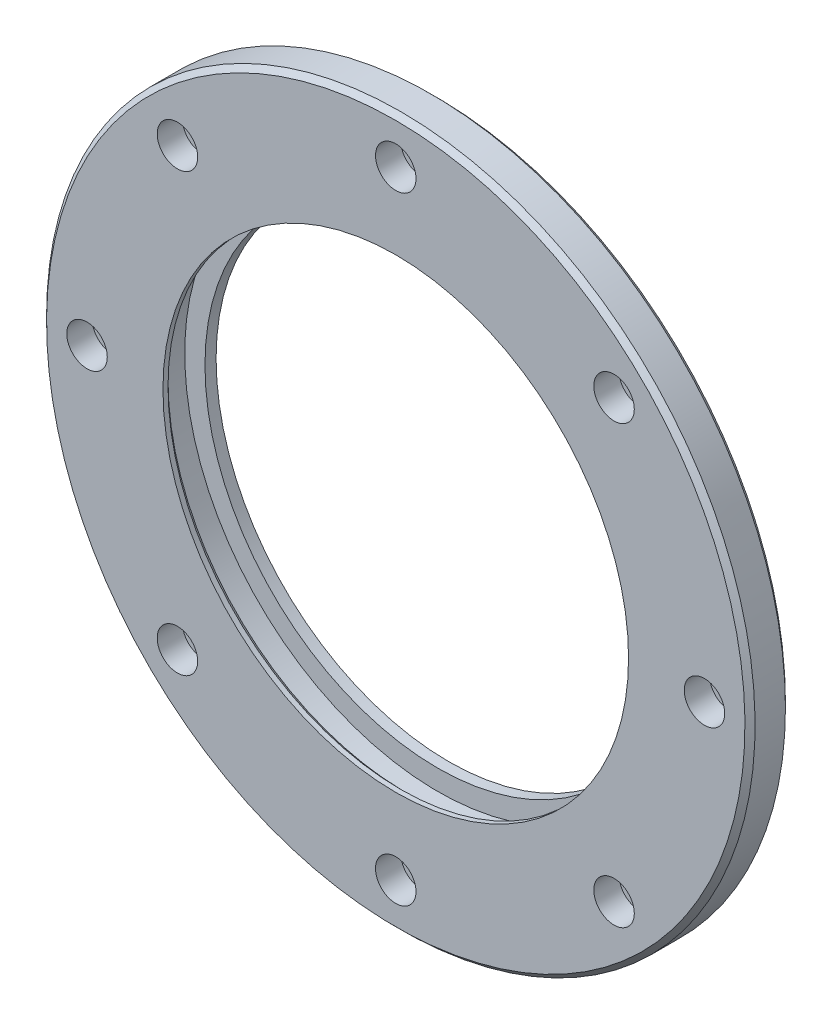
ISO-10303-21;
HEADER;
FILE_DESCRIPTION(('STEP AP214'),'2;1');
FILE_NAME('part.step','',(''),(''),'','','');
FILE_SCHEMA(('AUTOMOTIVE_DESIGN { 1 0 10303 214 1 1 1 1 }'));
ENDSEC;
DATA;
#1=APPLICATION_CONTEXT('core data for automotive mechanical design processes');
#2=APPLICATION_PROTOCOL_DEFINITION('international standard','automotive_design',2000,#1);
#3=PRODUCT_CONTEXT('',#1,'mechanical');
#4=PRODUCT('Part','Part','',(#3));
#5=PRODUCT_RELATED_PRODUCT_CATEGORY('part','',(#4));
#6=PRODUCT_DEFINITION_FORMATION('','',#4);
#7=PRODUCT_DEFINITION_CONTEXT('part definition',#1,'design');
#8=PRODUCT_DEFINITION('design','',#6,#7);
#9=PRODUCT_DEFINITION_SHAPE('','',#8);
#10=(LENGTH_UNIT() NAMED_UNIT(*) SI_UNIT(.MILLI.,.METRE.));
#11=(NAMED_UNIT(*) PLANE_ANGLE_UNIT() SI_UNIT($,.RADIAN.));
#12=(NAMED_UNIT(*) SI_UNIT($,.STERADIAN.) SOLID_ANGLE_UNIT());
#13=UNCERTAINTY_MEASURE_WITH_UNIT(LENGTH_MEASURE(1.E-05),#10,'distance_accuracy_value','');
#14=(GEOMETRIC_REPRESENTATION_CONTEXT(3) GLOBAL_UNCERTAINTY_ASSIGNED_CONTEXT((#13)) GLOBAL_UNIT_ASSIGNED_CONTEXT((#10,
#11,#12)) REPRESENTATION_CONTEXT('',''));
#15=CARTESIAN_POINT('',(0.,0.,0.));
#16=DIRECTION('',(0.,0.,1.));
#17=DIRECTION('',(1.,0.,0.));
#18=AXIS2_PLACEMENT_3D('',#15,#16,#17);
#19=CARTESIAN_POINT('',(0.,-15.,-42.5383077103199));
#20=DIRECTION('',(0.,0.,-1.));
#21=DIRECTION('',(-1.,0.,0.));
#22=AXIS2_PLACEMENT_3D('',#19,#20,#21);
#23=CONICAL_SURFACE('',#22,53.,0.785398163397448);
#24=CARTESIAN_POINT('',(0.,-15.,-42.5383077103199));
#25=DIRECTION('',(0.,0.,-1.));
#26=DIRECTION('',(-1.,0.,0.));
#27=AXIS2_PLACEMENT_3D('',#24,#25,#26);
#28=CIRCLE('',#27,53.);
#29=CARTESIAN_POINT('',(-53.,-15.,-42.5383077103199));
#30=VERTEX_POINT('',#29);
#31=EDGE_CURVE('E19',#30,#30,#28,.T.);
#32=ORIENTED_EDGE('',*,*,#31,.T.);
#33=EDGE_LOOP('',(#32));
#34=FACE_BOUND('',#33,.T.);
#35=CARTESIAN_POINT('',(0.,-15.,-42.0383077103199));
#36=DIRECTION('',(0.,0.,-1.));
#37=DIRECTION('',(-1.,0.,0.));
#38=AXIS2_PLACEMENT_3D('',#35,#36,#37);
#39=CIRCLE('',#38,52.5);
#40=CARTESIAN_POINT('',(-52.5,-15.,-42.0383077103199));
#41=VERTEX_POINT('',#40);
#42=EDGE_CURVE('E31',#41,#41,#39,.F.);
#43=ORIENTED_EDGE('',*,*,#42,.T.);
#44=EDGE_LOOP('',(#43));
#45=FACE_BOUND('',#44,.T.);
#46=ADVANCED_FACE('F16',(#34,#45),#23,.F.);
#47=CARTESIAN_POINT('',(0.,-15.,-38.0383077103199));
#48=DIRECTION('',(0.,0.,-1.));
#49=DIRECTION('',(-1.,0.,0.));
#50=AXIS2_PLACEMENT_3D('',#47,#48,#49);
#51=CYLINDRICAL_SURFACE('',#50,52.5);
#52=CARTESIAN_POINT('',(0.,-15.,-40.5383077103199));
#53=DIRECTION('',(0.,0.,-1.));
#54=DIRECTION('',(-1.,0.,0.));
#55=AXIS2_PLACEMENT_3D('',#52,#53,#54);
#56=CIRCLE('',#55,52.5);
#57=CARTESIAN_POINT('',(-52.5,-15.,-40.5383077103199));
#58=VERTEX_POINT('',#57);
#59=EDGE_CURVE('E156',#58,#58,#56,.F.);
#60=ORIENTED_EDGE('',*,*,#59,.T.);
#61=EDGE_LOOP('',(#60));
#62=FACE_BOUND('',#61,.T.);
#63=ORIENTED_EDGE('',*,*,#42,.F.);
#64=EDGE_LOOP('',(#63));
#65=FACE_BOUND('',#64,.T.);
#66=ADVANCED_FACE('F167',(#62,#65),#51,.F.);
#67=CARTESIAN_POINT('',(0.,-15.,-42.5383077103199));
#68=DIRECTION('',(0.,0.,1.));
#69=DIRECTION('',(1.,0.,0.));
#70=AXIS2_PLACEMENT_3D('',#67,#68,#69);
#71=PLANE('',#70);
#72=CARTESIAN_POINT('',(0.,-15.,-42.5383077103199));
#73=DIRECTION('',(0.,0.,1.));
#74=DIRECTION('',(1.,0.,0.));
#75=AXIS2_PLACEMENT_3D('',#72,#73,#74);
#76=CIRCLE('',#75,54.5);
#77=CARTESIAN_POINT('',(54.5,-15.,-42.5383077103199));
#78=VERTEX_POINT('',#77);
#79=EDGE_CURVE('E154',#78,#78,#76,.T.);
#80=ORIENTED_EDGE('',*,*,#79,.F.);
#81=EDGE_LOOP('',(#80));
#82=FACE_BOUND('',#81,.T.);
#83=ORIENTED_EDGE('',*,*,#31,.F.);
#84=EDGE_LOOP('',(#83));
#85=FACE_BOUND('',#84,.T.);
#86=ADVANCED_FACE('F169',(#82,#85),#71,.F.);
#87=CARTESIAN_POINT('',(0.,-15.,-40.5383077103199));
#88=DIRECTION('',(0.,0.,1.));
#89=DIRECTION('',(1.,0.,0.));
#90=AXIS2_PLACEMENT_3D('',#87,#88,#89);
#91=PLANE('',#90);
#92=CARTESIAN_POINT('',(0.,-15.,-40.5383077103199));
#93=DIRECTION('',(0.,0.,1.));
#94=DIRECTION('',(1.,0.,0.));
#95=AXIS2_PLACEMENT_3D('',#92,#93,#94);
#96=CIRCLE('',#95,46.);
#97=CARTESIAN_POINT('',(46.,-15.,-40.5383077103199));
#98=VERTEX_POINT('',#97);
#99=EDGE_CURVE('E151',#98,#98,#96,.T.);
#100=ORIENTED_EDGE('',*,*,#99,.T.);
#101=EDGE_LOOP('',(#100));
#102=FACE_BOUND('',#101,.T.);
#103=ORIENTED_EDGE('',*,*,#59,.F.);
#104=EDGE_LOOP('',(#103));
#105=FACE_BOUND('',#104,.T.);
#106=ADVANCED_FACE('F175',(#102,#105),#91,.F.);
#107=CARTESIAN_POINT('',(0.,-15.,-42.0383077103199));
#108=DIRECTION('',(0.,0.,1.));
#109=DIRECTION('',(1.,0.,0.));
#110=AXIS2_PLACEMENT_3D('',#107,#108,#109);
#111=CONICAL_SURFACE('',#110,55.,0.785398163397428);
#112=ORIENTED_EDGE('',*,*,#79,.T.);
#113=EDGE_LOOP('',(#112));
#114=FACE_BOUND('',#113,.T.);
#115=CARTESIAN_POINT('',(0.,-15.,-42.0383077103199));
#116=DIRECTION('',(0.,0.,-1.));
#117=DIRECTION('',(-1.,0.,0.));
#118=AXIS2_PLACEMENT_3D('',#115,#116,#117);
#119=CIRCLE('',#118,55.);
#120=CARTESIAN_POINT('',(-55.,-15.,-42.0383077103199));
#121=VERTEX_POINT('',#120);
#122=EDGE_CURVE('E150',#121,#121,#119,.F.);
#123=ORIENTED_EDGE('',*,*,#122,.F.);
#124=EDGE_LOOP('',(#123));
#125=FACE_BOUND('',#124,.T.);
#126=ADVANCED_FACE('F324',(#114,#125),#111,.T.);
#127=CARTESIAN_POINT('',(0.,-15.,-191.030731759495));
#128=DIRECTION('',(0.,0.,1.));
#129=DIRECTION('',(1.,0.,0.));
#130=AXIS2_PLACEMENT_3D('',#127,#128,#129);
#131=CYLINDRICAL_SURFACE('',#130,46.);
#132=ORIENTED_EDGE('',*,*,#99,.F.);
#133=EDGE_LOOP('',(#132));
#134=FACE_BOUND('',#133,.T.);
#135=CARTESIAN_POINT('',(0.,-15.,-38.3383077103199));
#136=DIRECTION('',(0.,0.,1.));
#137=DIRECTION('',(1.,0.,0.));
#138=AXIS2_PLACEMENT_3D('',#135,#136,#137);
#139=CIRCLE('',#138,46.);
#140=CARTESIAN_POINT('',(46.,-15.,-38.3383077103199));
#141=VERTEX_POINT('',#140);
#142=EDGE_CURVE('E147',#141,#141,#139,.F.);
#143=ORIENTED_EDGE('',*,*,#142,.F.);
#144=EDGE_LOOP('',(#143));
#145=FACE_BOUND('',#144,.T.);
#146=ADVANCED_FACE('F320',(#134,#145),#131,.F.);
#147=CARTESIAN_POINT('',(0.,-15.,-38.0383077103199));
#148=DIRECTION('',(0.,0.,-1.));
#149=DIRECTION('',(-1.,0.,0.));
#150=AXIS2_PLACEMENT_3D('',#147,#148,#149);
#151=CYLINDRICAL_SURFACE('',#150,55.);
#152=CARTESIAN_POINT('',(0.,-15.,-38.0383077103199));
#153=DIRECTION('',(0.,0.,-1.));
#154=DIRECTION('',(-1.,0.,0.));
#155=AXIS2_PLACEMENT_3D('',#152,#153,#154);
#156=CIRCLE('',#155,55.);
#157=CARTESIAN_POINT('',(-55.,-15.,-38.0383077103199));
#158=VERTEX_POINT('',#157);
#159=EDGE_CURVE('E144',#158,#158,#156,.T.);
#160=ORIENTED_EDGE('',*,*,#159,.T.);
#161=EDGE_LOOP('',(#160));
#162=FACE_BOUND('',#161,.T.);
#163=ORIENTED_EDGE('',*,*,#122,.T.);
#164=EDGE_LOOP('',(#163));
#165=FACE_BOUND('',#164,.T.);
#166=ADVANCED_FACE('F316',(#162,#165),#151,.T.);
#167=CARTESIAN_POINT('',(0.,-15.,-38.3383077103199));
#168=DIRECTION('',(0.,0.,1.));
#169=DIRECTION('',(1.,0.,0.));
#170=AXIS2_PLACEMENT_3D('',#167,#168,#169);
#171=PLANE('',#170);
#172=ORIENTED_EDGE('',*,*,#142,.T.);
#173=EDGE_LOOP('',(#172));
#174=FACE_BOUND('',#173,.T.);
#175=CARTESIAN_POINT('',(0.,-15.,-38.3383077103199));
#176=DIRECTION('',(0.,0.,1.));
#177=DIRECTION('',(1.,0.,0.));
#178=AXIS2_PLACEMENT_3D('',#175,#176,#177);
#179=CIRCLE('',#178,50.);
#180=CARTESIAN_POINT('',(50.,-15.,-38.3383077103199));
#181=VERTEX_POINT('',#180);
#182=EDGE_CURVE('E141',#181,#181,#179,.T.);
#183=ORIENTED_EDGE('',*,*,#182,.T.);
#184=EDGE_LOOP('',(#183));
#185=FACE_BOUND('',#184,.T.);
#186=ADVANCED_FACE('F312',(#174,#185),#171,.T.);
#187=CARTESIAN_POINT('',(0.,-15.,-38.0383077103199));
#188=DIRECTION('',(0.,0.,1.));
#189=DIRECTION('',(1.,0.,0.));
#190=AXIS2_PLACEMENT_3D('',#187,#188,#189);
#191=PLANE('',#190);
#192=ORIENTED_EDGE('',*,*,#159,.F.);
#193=EDGE_LOOP('',(#192));
#194=FACE_BOUND('',#193,.T.);
#195=CARTESIAN_POINT('',(0.,46.,-38.0383077103199));
#196=DIRECTION('',(0.,0.,1.));
#197=DIRECTION('',(1.,0.,0.));
#198=AXIS2_PLACEMENT_3D('',#195,#196,#197);
#199=CIRCLE('',#198,2.25);
#200=CARTESIAN_POINT('',(2.25,46.,-38.0383077103199));
#201=VERTEX_POINT('',#200);
#202=EDGE_CURVE('E114',#201,#201,#199,.T.);
#203=ORIENTED_EDGE('',*,*,#202,.T.);
#204=EDGE_LOOP('',(#203));
#205=FACE_BOUND('',#204,.T.);
#206=CARTESIAN_POINT('',(43.1335136523795,28.1335136523793,-38.0383077103199));
#207=DIRECTION('',(0.,0.,1.));
#208=DIRECTION('',(1.,0.,0.));
#209=AXIS2_PLACEMENT_3D('',#206,#207,#208);
#210=CIRCLE('',#209,2.25);
#211=CARTESIAN_POINT('',(45.3835136523795,28.1335136523793,-38.0383077103199));
#212=VERTEX_POINT('',#211);
#213=EDGE_CURVE('E117',#212,#212,#210,.T.);
#214=ORIENTED_EDGE('',*,*,#213,.T.);
#215=EDGE_LOOP('',(#214));
#216=FACE_BOUND('',#215,.T.);
#217=CARTESIAN_POINT('',(61.,-15.0000000000002,-38.0383077103199));
#218=DIRECTION('',(0.,0.,1.));
#219=DIRECTION('',(1.,0.,0.));
#220=AXIS2_PLACEMENT_3D('',#217,#218,#219);
#221=CIRCLE('',#220,2.25);
#222=CARTESIAN_POINT('',(63.25,-15.0000000000002,-38.0383077103199));
#223=VERTEX_POINT('',#222);
#224=EDGE_CURVE('E120',#223,#223,#221,.T.);
#225=ORIENTED_EDGE('',*,*,#224,.T.);
#226=EDGE_LOOP('',(#225));
#227=FACE_BOUND('',#226,.T.);
#228=CARTESIAN_POINT('',(43.1335136523792,-58.1335136523796,-38.0383077103199));
#229=DIRECTION('',(0.,0.,1.));
#230=DIRECTION('',(1.,0.,0.));
#231=AXIS2_PLACEMENT_3D('',#228,#229,#230);
#232=CIRCLE('',#231,2.25);
#233=CARTESIAN_POINT('',(45.3835136523792,-58.1335136523796,-38.0383077103199));
#234=VERTEX_POINT('',#233);
#235=EDGE_CURVE('E123',#234,#234,#232,.T.);
#236=ORIENTED_EDGE('',*,*,#235,.T.);
#237=EDGE_LOOP('',(#236));
#238=FACE_BOUND('',#237,.T.);
#239=CARTESIAN_POINT('',(0.,-76.,-38.0383077103199));
#240=DIRECTION('',(0.,0.,1.));
#241=DIRECTION('',(1.,0.,0.));
#242=AXIS2_PLACEMENT_3D('',#239,#240,#241);
#243=CIRCLE('',#242,2.25);
#244=CARTESIAN_POINT('',(2.25,-76.,-38.0383077103199));
#245=VERTEX_POINT('',#244);
#246=EDGE_CURVE('E126',#245,#245,#243,.T.);
#247=ORIENTED_EDGE('',*,*,#246,.T.);
#248=EDGE_LOOP('',(#247));
#249=FACE_BOUND('',#248,.T.);
#250=CARTESIAN_POINT('',(-43.1335136523798,-58.133513652379,-38.0383077103199));
#251=DIRECTION('',(0.,0.,1.));
#252=DIRECTION('',(1.,0.,0.));
#253=AXIS2_PLACEMENT_3D('',#250,#251,#252);
#254=CIRCLE('',#253,2.25);
#255=CARTESIAN_POINT('',(-40.8835136523798,-58.133513652379,-38.0383077103199));
#256=VERTEX_POINT('',#255);
#257=EDGE_CURVE('E129',#256,#256,#254,.T.);
#258=ORIENTED_EDGE('',*,*,#257,.T.);
#259=EDGE_LOOP('',(#258));
#260=FACE_BOUND('',#259,.T.);
#261=CARTESIAN_POINT('',(-61.,-14.9999999999994,-38.0383077103199));
#262=DIRECTION('',(0.,0.,1.));
#263=DIRECTION('',(1.,0.,0.));
#264=AXIS2_PLACEMENT_3D('',#261,#262,#263);
#265=CIRCLE('',#264,2.25);
#266=CARTESIAN_POINT('',(-58.75,-14.9999999999994,-38.0383077103199));
#267=VERTEX_POINT('',#266);
#268=EDGE_CURVE('E132',#267,#267,#265,.T.);
#269=ORIENTED_EDGE('',*,*,#268,.T.);
#270=EDGE_LOOP('',(#269));
#271=FACE_BOUND('',#270,.T.);
#272=CARTESIAN_POINT('',(-43.1335136523789,28.1335136523799,-38.0383077103199));
#273=DIRECTION('',(0.,0.,1.));
#274=DIRECTION('',(1.,0.,0.));
#275=AXIS2_PLACEMENT_3D('',#272,#273,#274);
#276=CIRCLE('',#275,2.25);
#277=CARTESIAN_POINT('',(-40.8835136523789,28.1335136523799,-38.0383077103199));
#278=VERTEX_POINT('',#277);
#279=EDGE_CURVE('E135',#278,#278,#276,.T.);
#280=ORIENTED_EDGE('',*,*,#279,.T.);
#281=EDGE_LOOP('',(#280));
#282=FACE_BOUND('',#281,.T.);
#283=CARTESIAN_POINT('',(0.,-15.,-38.0383077103199));
#284=DIRECTION('',(0.,0.,1.));
#285=DIRECTION('',(1.,0.,0.));
#286=AXIS2_PLACEMENT_3D('',#283,#284,#285);
#287=CIRCLE('',#286,69.0000000000001);
#288=CARTESIAN_POINT('',(69.0000000000001,-15.,-38.0383077103199));
#289=VERTEX_POINT('',#288);
#290=EDGE_CURVE('E138',#289,#289,#287,.T.);
#291=ORIENTED_EDGE('',*,*,#290,.F.);
#292=EDGE_LOOP('',(#291));
#293=FACE_BOUND('',#292,.T.);
#294=ADVANCED_FACE('F308',(#194,#205,#216,#227,#238,#249,#260,#271,#282,#293),#191,.F.);
#295=CARTESIAN_POINT('',(0.,-15.,-38.3383077103199));
#296=DIRECTION('',(0.,0.,1.));
#297=DIRECTION('',(1.,0.,0.));
#298=AXIS2_PLACEMENT_3D('',#295,#296,#297);
#299=CYLINDRICAL_SURFACE('',#298,50.);
#300=ORIENTED_EDGE('',*,*,#182,.F.);
#301=EDGE_LOOP('',(#300));
#302=FACE_BOUND('',#301,.T.);
#303=CARTESIAN_POINT('',(0.,-15.,-32.0383077103199));
#304=DIRECTION('',(0.,0.,1.));
#305=DIRECTION('',(1.,0.,0.));
#306=AXIS2_PLACEMENT_3D('',#303,#304,#305);
#307=CIRCLE('',#306,50.);
#308=CARTESIAN_POINT('',(50.,-15.,-32.0383077103199));
#309=VERTEX_POINT('',#308);
#310=EDGE_CURVE('E111',#309,#309,#307,.T.);
#311=ORIENTED_EDGE('',*,*,#310,.T.);
#312=EDGE_LOOP('',(#311));
#313=FACE_BOUND('',#312,.T.);
#314=ADVANCED_FACE('F304',(#302,#313),#299,.F.);
#315=CARTESIAN_POINT('',(0.,-15.,-37.0383077103199));
#316=DIRECTION('',(0.,0.,1.));
#317=DIRECTION('',(1.,0.,0.));
#318=AXIS2_PLACEMENT_3D('',#315,#316,#317);
#319=CONICAL_SURFACE('',#318,70.,0.785398163397441);
#320=CARTESIAN_POINT('',(0.,-15.,-37.0383077103199));
#321=DIRECTION('',(0.,0.,-1.));
#322=DIRECTION('',(-1.,0.,0.));
#323=AXIS2_PLACEMENT_3D('',#320,#321,#322);
#324=CIRCLE('',#323,70.);
#325=CARTESIAN_POINT('',(-70.,-15.,-37.0383077103199));
#326=VERTEX_POINT('',#325);
#327=EDGE_CURVE('E110',#326,#326,#324,.F.);
#328=ORIENTED_EDGE('',*,*,#327,.F.);
#329=EDGE_LOOP('',(#328));
#330=FACE_BOUND('',#329,.T.);
#331=ORIENTED_EDGE('',*,*,#290,.T.);
#332=EDGE_LOOP('',(#331));
#333=FACE_BOUND('',#332,.T.);
#334=ADVANCED_FACE('F300',(#330,#333),#319,.T.);
#335=CARTESIAN_POINT('',(-43.1335136523789,28.1335136523799,-30.0383077103199));
#336=DIRECTION('',(0.,0.,1.));
#337=DIRECTION('',(1.,0.,0.));
#338=AXIS2_PLACEMENT_3D('',#335,#336,#337);
#339=CYLINDRICAL_SURFACE('',#338,2.25);
#340=ORIENTED_EDGE('',*,*,#279,.F.);
#341=EDGE_LOOP('',(#340));
#342=FACE_BOUND('',#341,.T.);
#343=CARTESIAN_POINT('',(-43.1335136523789,28.1335136523799,-35.0383077103199));
#344=DIRECTION('',(0.,0.,1.));
#345=DIRECTION('',(1.,0.,0.));
#346=AXIS2_PLACEMENT_3D('',#343,#344,#345);
#347=CIRCLE('',#346,2.25);
#348=CARTESIAN_POINT('',(-40.8835136523789,28.1335136523799,-35.0383077103199));
#349=VERTEX_POINT('',#348);
#350=EDGE_CURVE('E107',#349,#349,#347,.T.);
#351=ORIENTED_EDGE('',*,*,#350,.T.);
#352=EDGE_LOOP('',(#351));
#353=FACE_BOUND('',#352,.T.);
#354=ADVANCED_FACE('F296',(#342,#353),#339,.F.);
#355=CARTESIAN_POINT('',(-61.,-14.9999999999994,-30.0383077103199));
#356=DIRECTION('',(0.,0.,1.));
#357=DIRECTION('',(1.,0.,0.));
#358=AXIS2_PLACEMENT_3D('',#355,#356,#357);
#359=CYLINDRICAL_SURFACE('',#358,2.25);
#360=ORIENTED_EDGE('',*,*,#268,.F.);
#361=EDGE_LOOP('',(#360));
#362=FACE_BOUND('',#361,.T.);
#363=CARTESIAN_POINT('',(-61.,-14.9999999999994,-35.0383077103199));
#364=DIRECTION('',(0.,0.,1.));
#365=DIRECTION('',(1.,0.,0.));
#366=AXIS2_PLACEMENT_3D('',#363,#364,#365);
#367=CIRCLE('',#366,2.25);
#368=CARTESIAN_POINT('',(-58.75,-14.9999999999994,-35.0383077103199));
#369=VERTEX_POINT('',#368);
#370=EDGE_CURVE('E104',#369,#369,#367,.T.);
#371=ORIENTED_EDGE('',*,*,#370,.T.);
#372=EDGE_LOOP('',(#371));
#373=FACE_BOUND('',#372,.T.);
#374=ADVANCED_FACE('F292',(#362,#373),#359,.F.);
#375=CARTESIAN_POINT('',(-43.1335136523798,-58.133513652379,-30.0383077103199));
#376=DIRECTION('',(0.,0.,1.));
#377=DIRECTION('',(1.,0.,0.));
#378=AXIS2_PLACEMENT_3D('',#375,#376,#377);
#379=CYLINDRICAL_SURFACE('',#378,2.25);
#380=ORIENTED_EDGE('',*,*,#257,.F.);
#381=EDGE_LOOP('',(#380));
#382=FACE_BOUND('',#381,.T.);
#383=CARTESIAN_POINT('',(-43.1335136523798,-58.133513652379,-35.0383077103199));
#384=DIRECTION('',(0.,0.,1.));
#385=DIRECTION('',(1.,0.,0.));
#386=AXIS2_PLACEMENT_3D('',#383,#384,#385);
#387=CIRCLE('',#386,2.25);
#388=CARTESIAN_POINT('',(-40.8835136523798,-58.133513652379,-35.0383077103199));
#389=VERTEX_POINT('',#388);
#390=EDGE_CURVE('E101',#389,#389,#387,.T.);
#391=ORIENTED_EDGE('',*,*,#390,.T.);
#392=EDGE_LOOP('',(#391));
#393=FACE_BOUND('',#392,.T.);
#394=ADVANCED_FACE('F288',(#382,#393),#379,.F.);
#395=CARTESIAN_POINT('',(0.,-76.,-30.0383077103199));
#396=DIRECTION('',(0.,0.,1.));
#397=DIRECTION('',(1.,0.,0.));
#398=AXIS2_PLACEMENT_3D('',#395,#396,#397);
#399=CYLINDRICAL_SURFACE('',#398,2.25);
#400=ORIENTED_EDGE('',*,*,#246,.F.);
#401=EDGE_LOOP('',(#400));
#402=FACE_BOUND('',#401,.T.);
#403=CARTESIAN_POINT('',(0.,-76.,-35.0383077103199));
#404=DIRECTION('',(0.,0.,1.));
#405=DIRECTION('',(1.,0.,0.));
#406=AXIS2_PLACEMENT_3D('',#403,#404,#405);
#407=CIRCLE('',#406,2.25);
#408=CARTESIAN_POINT('',(2.25,-76.,-35.0383077103199));
#409=VERTEX_POINT('',#408);
#410=EDGE_CURVE('E98',#409,#409,#407,.T.);
#411=ORIENTED_EDGE('',*,*,#410,.T.);
#412=EDGE_LOOP('',(#411));
#413=FACE_BOUND('',#412,.T.);
#414=ADVANCED_FACE('F284',(#402,#413),#399,.F.);
#415=CARTESIAN_POINT('',(43.1335136523792,-58.1335136523796,-30.0383077103199));
#416=DIRECTION('',(0.,0.,1.));
#417=DIRECTION('',(1.,0.,0.));
#418=AXIS2_PLACEMENT_3D('',#415,#416,#417);
#419=CYLINDRICAL_SURFACE('',#418,2.25);
#420=ORIENTED_EDGE('',*,*,#235,.F.);
#421=EDGE_LOOP('',(#420));
#422=FACE_BOUND('',#421,.T.);
#423=CARTESIAN_POINT('',(43.1335136523792,-58.1335136523796,-35.0383077103199));
#424=DIRECTION('',(0.,0.,1.));
#425=DIRECTION('',(1.,0.,0.));
#426=AXIS2_PLACEMENT_3D('',#423,#424,#425);
#427=CIRCLE('',#426,2.25);
#428=CARTESIAN_POINT('',(45.3835136523792,-58.1335136523796,-35.0383077103199));
#429=VERTEX_POINT('',#428);
#430=EDGE_CURVE('E95',#429,#429,#427,.T.);
#431=ORIENTED_EDGE('',*,*,#430,.T.);
#432=EDGE_LOOP('',(#431));
#433=FACE_BOUND('',#432,.T.);
#434=ADVANCED_FACE('F280',(#422,#433),#419,.F.);
#435=CARTESIAN_POINT('',(61.,-15.0000000000002,-30.0383077103199));
#436=DIRECTION('',(0.,0.,1.));
#437=DIRECTION('',(1.,0.,0.));
#438=AXIS2_PLACEMENT_3D('',#435,#436,#437);
#439=CYLINDRICAL_SURFACE('',#438,2.25);
#440=ORIENTED_EDGE('',*,*,#224,.F.);
#441=EDGE_LOOP('',(#440));
#442=FACE_BOUND('',#441,.T.);
#443=CARTESIAN_POINT('',(61.,-15.0000000000002,-35.0383077103199));
#444=DIRECTION('',(0.,0.,1.));
#445=DIRECTION('',(1.,0.,0.));
#446=AXIS2_PLACEMENT_3D('',#443,#444,#445);
#447=CIRCLE('',#446,2.25);
#448=CARTESIAN_POINT('',(63.25,-15.0000000000002,-35.0383077103199));
#449=VERTEX_POINT('',#448);
#450=EDGE_CURVE('E92',#449,#449,#447,.T.);
#451=ORIENTED_EDGE('',*,*,#450,.T.);
#452=EDGE_LOOP('',(#451));
#453=FACE_BOUND('',#452,.T.);
#454=ADVANCED_FACE('F276',(#442,#453),#439,.F.);
#455=CARTESIAN_POINT('',(43.1335136523795,28.1335136523793,-30.0383077103199));
#456=DIRECTION('',(0.,0.,1.));
#457=DIRECTION('',(1.,0.,0.));
#458=AXIS2_PLACEMENT_3D('',#455,#456,#457);
#459=CYLINDRICAL_SURFACE('',#458,2.25);
#460=ORIENTED_EDGE('',*,*,#213,.F.);
#461=EDGE_LOOP('',(#460));
#462=FACE_BOUND('',#461,.T.);
#463=CARTESIAN_POINT('',(43.1335136523795,28.1335136523793,-35.0383077103199));
#464=DIRECTION('',(0.,0.,1.));
#465=DIRECTION('',(1.,0.,0.));
#466=AXIS2_PLACEMENT_3D('',#463,#464,#465);
#467=CIRCLE('',#466,2.25);
#468=CARTESIAN_POINT('',(45.3835136523795,28.1335136523793,-35.0383077103199));
#469=VERTEX_POINT('',#468);
#470=EDGE_CURVE('E89',#469,#469,#467,.T.);
#471=ORIENTED_EDGE('',*,*,#470,.T.);
#472=EDGE_LOOP('',(#471));
#473=FACE_BOUND('',#472,.T.);
#474=ADVANCED_FACE('F272',(#462,#473),#459,.F.);
#475=CARTESIAN_POINT('',(0.,46.,-30.0383077103199));
#476=DIRECTION('',(0.,0.,1.));
#477=DIRECTION('',(1.,0.,0.));
#478=AXIS2_PLACEMENT_3D('',#475,#476,#477);
#479=CYLINDRICAL_SURFACE('',#478,2.25);
#480=ORIENTED_EDGE('',*,*,#202,.F.);
#481=EDGE_LOOP('',(#480));
#482=FACE_BOUND('',#481,.T.);
#483=CARTESIAN_POINT('',(0.,46.,-35.0383077103199));
#484=DIRECTION('',(0.,0.,1.));
#485=DIRECTION('',(1.,0.,0.));
#486=AXIS2_PLACEMENT_3D('',#483,#484,#485);
#487=CIRCLE('',#486,2.25);
#488=CARTESIAN_POINT('',(2.25,46.,-35.0383077103199));
#489=VERTEX_POINT('',#488);
#490=EDGE_CURVE('E86',#489,#489,#487,.T.);
#491=ORIENTED_EDGE('',*,*,#490,.T.);
#492=EDGE_LOOP('',(#491));
#493=FACE_BOUND('',#492,.T.);
#494=ADVANCED_FACE('F268',(#482,#493),#479,.F.);
#495=CARTESIAN_POINT('',(0.,-15.,-32.0383077103199));
#496=DIRECTION('',(0.,0.,1.));
#497=DIRECTION('',(1.,0.,0.));
#498=AXIS2_PLACEMENT_3D('',#495,#496,#497);
#499=PLANE('',#498);
#500=ORIENTED_EDGE('',*,*,#310,.F.);
#501=EDGE_LOOP('',(#500));
#502=FACE_BOUND('',#501,.T.);
#503=CARTESIAN_POINT('',(0.,-15.,-32.0383077103199));
#504=DIRECTION('',(0.,0.,-1.));
#505=DIRECTION('',(-1.,0.,0.));
#506=AXIS2_PLACEMENT_3D('',#503,#504,#505);
#507=CIRCLE('',#506,46.9999999999999);
#508=CARTESIAN_POINT('',(-46.9999999999999,-15.,-32.0383077103199));
#509=VERTEX_POINT('',#508);
#510=EDGE_CURVE('E83',#509,#509,#507,.F.);
#511=ORIENTED_EDGE('',*,*,#510,.T.);
#512=EDGE_LOOP('',(#511));
#513=FACE_BOUND('',#512,.T.);
#514=ADVANCED_FACE('F264',(#502,#513),#499,.F.);
#515=CARTESIAN_POINT('',(0.,-15.,-30.0383077103199));
#516=DIRECTION('',(0.,0.,-1.));
#517=DIRECTION('',(-1.,0.,0.));
#518=AXIS2_PLACEMENT_3D('',#515,#516,#517);
#519=CYLINDRICAL_SURFACE('',#518,70.);
#520=ORIENTED_EDGE('',*,*,#327,.T.);
#521=EDGE_LOOP('',(#520));
#522=FACE_BOUND('',#521,.T.);
#523=CARTESIAN_POINT('',(0.,-15.,-31.0383077103198));
#524=DIRECTION('',(0.,0.,-1.));
#525=DIRECTION('',(-1.,0.,0.));
#526=AXIS2_PLACEMENT_3D('',#523,#524,#525);
#527=CIRCLE('',#526,70.);
#528=CARTESIAN_POINT('',(-70.,-15.,-31.0383077103198));
#529=VERTEX_POINT('',#528);
#530=EDGE_CURVE('E82',#529,#529,#527,.F.);
#531=ORIENTED_EDGE('',*,*,#530,.F.);
#532=EDGE_LOOP('',(#531));
#533=FACE_BOUND('',#532,.T.);
#534=ADVANCED_FACE('F260',(#522,#533),#519,.T.);
#535=CARTESIAN_POINT('',(-41.5425233947091,29.7245039100496,-35.0383077103199));
#536=DIRECTION('',(0.,0.,-1.));
#537=DIRECTION('',(-1.,0.,0.));
#538=AXIS2_PLACEMENT_3D('',#535,#536,#537);
#539=PLANE('',#538);
#540=CARTESIAN_POINT('',(-43.1335136523789,28.1335136523799,-35.0383077103199));
#541=DIRECTION('',(0.,0.,1.));
#542=DIRECTION('',(1.,0.,0.));
#543=AXIS2_PLACEMENT_3D('',#540,#541,#542);
#544=CIRCLE('',#543,4.);
#545=CARTESIAN_POINT('',(-39.1335136523789,28.1335136523799,-35.0383077103199));
#546=VERTEX_POINT('',#545);
#547=EDGE_CURVE('E79',#546,#546,#544,.T.);
#548=ORIENTED_EDGE('',*,*,#547,.T.);
#549=EDGE_LOOP('',(#548));
#550=FACE_BOUND('',#549,.T.);
#551=ORIENTED_EDGE('',*,*,#350,.F.);
#552=EDGE_LOOP('',(#551));
#553=FACE_BOUND('',#552,.T.);
#554=ADVANCED_FACE('F256',(#550,#553),#539,.F.);
#555=CARTESIAN_POINT('',(-61.,-12.7499999999994,-35.0383077103199));
#556=DIRECTION('',(0.,0.,-1.));
#557=DIRECTION('',(-1.,0.,0.));
#558=AXIS2_PLACEMENT_3D('',#555,#556,#557);
#559=PLANE('',#558);
#560=CARTESIAN_POINT('',(-61.,-14.9999999999994,-35.0383077103199));
#561=DIRECTION('',(0.,0.,1.));
#562=DIRECTION('',(1.,0.,0.));
#563=AXIS2_PLACEMENT_3D('',#560,#561,#562);
#564=CIRCLE('',#563,4.);
#565=CARTESIAN_POINT('',(-57.,-14.9999999999994,-35.0383077103199));
#566=VERTEX_POINT('',#565);
#567=EDGE_CURVE('E76',#566,#566,#564,.T.);
#568=ORIENTED_EDGE('',*,*,#567,.T.);
#569=EDGE_LOOP('',(#568));
#570=FACE_BOUND('',#569,.T.);
#571=ORIENTED_EDGE('',*,*,#370,.F.);
#572=EDGE_LOOP('',(#571));
#573=FACE_BOUND('',#572,.T.);
#574=ADVANCED_FACE('F252',(#570,#573),#559,.F.);
#575=CARTESIAN_POINT('',(-44.7245039100495,-56.5425233947093,-35.0383077103199));
#576=DIRECTION('',(0.,0.,-1.));
#577=DIRECTION('',(-1.,0.,0.));
#578=AXIS2_PLACEMENT_3D('',#575,#576,#577);
#579=PLANE('',#578);
#580=CARTESIAN_POINT('',(-43.1335136523798,-58.133513652379,-35.0383077103199));
#581=DIRECTION('',(0.,0.,1.));
#582=DIRECTION('',(1.,0.,0.));
#583=AXIS2_PLACEMENT_3D('',#580,#581,#582);
#584=CIRCLE('',#583,4.);
#585=CARTESIAN_POINT('',(-39.1335136523798,-58.133513652379,-35.0383077103199));
#586=VERTEX_POINT('',#585);
#587=EDGE_CURVE('E73',#586,#586,#584,.T.);
#588=ORIENTED_EDGE('',*,*,#587,.T.);
#589=EDGE_LOOP('',(#588));
#590=FACE_BOUND('',#589,.T.);
#591=ORIENTED_EDGE('',*,*,#390,.F.);
#592=EDGE_LOOP('',(#591));
#593=FACE_BOUND('',#592,.T.);
#594=ADVANCED_FACE('F248',(#590,#593),#579,.F.);
#595=CARTESIAN_POINT('',(-2.25,-76.,-35.0383077103199));
#596=DIRECTION('',(0.,0.,-1.));
#597=DIRECTION('',(-1.,0.,0.));
#598=AXIS2_PLACEMENT_3D('',#595,#596,#597);
#599=PLANE('',#598);
#600=CARTESIAN_POINT('',(0.,-76.,-35.0383077103199));
#601=DIRECTION('',(0.,0.,1.));
#602=DIRECTION('',(1.,0.,0.));
#603=AXIS2_PLACEMENT_3D('',#600,#601,#602);
#604=CIRCLE('',#603,4.);
#605=CARTESIAN_POINT('',(4.,-76.,-35.0383077103199));
#606=VERTEX_POINT('',#605);
#607=EDGE_CURVE('E70',#606,#606,#604,.T.);
#608=ORIENTED_EDGE('',*,*,#607,.T.);
#609=EDGE_LOOP('',(#608));
#610=FACE_BOUND('',#609,.T.);
#611=ORIENTED_EDGE('',*,*,#410,.F.);
#612=EDGE_LOOP('',(#611));
#613=FACE_BOUND('',#612,.T.);
#614=ADVANCED_FACE('F244',(#610,#613),#599,.F.);
#615=CARTESIAN_POINT('',(41.5425233947094,-59.7245039100493,-35.0383077103199));
#616=DIRECTION('',(0.,0.,-1.));
#617=DIRECTION('',(-1.,0.,0.));
#618=AXIS2_PLACEMENT_3D('',#615,#616,#617);
#619=PLANE('',#618);
#620=CARTESIAN_POINT('',(43.1335136523792,-58.1335136523796,-35.0383077103199));
#621=DIRECTION('',(0.,0.,1.));
#622=DIRECTION('',(1.,0.,0.));
#623=AXIS2_PLACEMENT_3D('',#620,#621,#622);
#624=CIRCLE('',#623,4.);
#625=CARTESIAN_POINT('',(47.1335136523792,-58.1335136523796,-35.0383077103199));
#626=VERTEX_POINT('',#625);
#627=EDGE_CURVE('E67',#626,#626,#624,.T.);
#628=ORIENTED_EDGE('',*,*,#627,.T.);
#629=EDGE_LOOP('',(#628));
#630=FACE_BOUND('',#629,.T.);
#631=ORIENTED_EDGE('',*,*,#430,.F.);
#632=EDGE_LOOP('',(#631));
#633=FACE_BOUND('',#632,.T.);
#634=ADVANCED_FACE('F240',(#630,#633),#619,.F.);
#635=CARTESIAN_POINT('',(61.,-17.2500000000002,-35.0383077103199));
#636=DIRECTION('',(0.,0.,-1.));
#637=DIRECTION('',(-1.,0.,0.));
#638=AXIS2_PLACEMENT_3D('',#635,#636,#637);
#639=PLANE('',#638);
#640=CARTESIAN_POINT('',(61.,-15.0000000000002,-35.0383077103199));
#641=DIRECTION('',(0.,0.,1.));
#642=DIRECTION('',(1.,0.,0.));
#643=AXIS2_PLACEMENT_3D('',#640,#641,#642);
#644=CIRCLE('',#643,4.);
#645=CARTESIAN_POINT('',(65.,-15.0000000000002,-35.0383077103199));
#646=VERTEX_POINT('',#645);
#647=EDGE_CURVE('E64',#646,#646,#644,.T.);
#648=ORIENTED_EDGE('',*,*,#647,.T.);
#649=EDGE_LOOP('',(#648));
#650=FACE_BOUND('',#649,.T.);
#651=ORIENTED_EDGE('',*,*,#450,.F.);
#652=EDGE_LOOP('',(#651));
#653=FACE_BOUND('',#652,.T.);
#654=ADVANCED_FACE('F236',(#650,#653),#639,.F.);
#655=CARTESIAN_POINT('',(44.7245039100492,26.5425233947096,-35.0383077103199));
#656=DIRECTION('',(0.,0.,-1.));
#657=DIRECTION('',(-1.,0.,0.));
#658=AXIS2_PLACEMENT_3D('',#655,#656,#657);
#659=PLANE('',#658);
#660=CARTESIAN_POINT('',(43.1335136523795,28.1335136523793,-35.0383077103199));
#661=DIRECTION('',(0.,0.,1.));
#662=DIRECTION('',(1.,0.,0.));
#663=AXIS2_PLACEMENT_3D('',#660,#661,#662);
#664=CIRCLE('',#663,4.);
#665=CARTESIAN_POINT('',(47.1335136523795,28.1335136523793,-35.0383077103199));
#666=VERTEX_POINT('',#665);
#667=EDGE_CURVE('E61',#666,#666,#664,.T.);
#668=ORIENTED_EDGE('',*,*,#667,.T.);
#669=EDGE_LOOP('',(#668));
#670=FACE_BOUND('',#669,.T.);
#671=ORIENTED_EDGE('',*,*,#470,.F.);
#672=EDGE_LOOP('',(#671));
#673=FACE_BOUND('',#672,.T.);
#674=ADVANCED_FACE('F232',(#670,#673),#659,.F.);
#675=CARTESIAN_POINT('',(2.25,46.,-35.0383077103199));
#676=DIRECTION('',(0.,0.,-1.));
#677=DIRECTION('',(-1.,0.,0.));
#678=AXIS2_PLACEMENT_3D('',#675,#676,#677);
#679=PLANE('',#678);
#680=CARTESIAN_POINT('',(0.,46.,-35.0383077103199));
#681=DIRECTION('',(0.,0.,1.));
#682=DIRECTION('',(1.,0.,0.));
#683=AXIS2_PLACEMENT_3D('',#680,#681,#682);
#684=CIRCLE('',#683,4.);
#685=CARTESIAN_POINT('',(4.,46.,-35.0383077103199));
#686=VERTEX_POINT('',#685);
#687=EDGE_CURVE('E58',#686,#686,#684,.T.);
#688=ORIENTED_EDGE('',*,*,#687,.T.);
#689=EDGE_LOOP('',(#688));
#690=FACE_BOUND('',#689,.T.);
#691=ORIENTED_EDGE('',*,*,#490,.F.);
#692=EDGE_LOOP('',(#691));
#693=FACE_BOUND('',#692,.T.);
#694=ADVANCED_FACE('F228',(#690,#693),#679,.F.);
#695=CARTESIAN_POINT('',(0.,-15.,-32.0383077103199));
#696=DIRECTION('',(0.,0.,-1.));
#697=DIRECTION('',(-1.,0.,0.));
#698=AXIS2_PLACEMENT_3D('',#695,#696,#697);
#699=CONICAL_SURFACE('',#698,46.9999999999999,0.785398163397441);
#700=ORIENTED_EDGE('',*,*,#510,.F.);
#701=EDGE_LOOP('',(#700));
#702=FACE_BOUND('',#701,.T.);
#703=CARTESIAN_POINT('',(0.,-15.,-31.03830771032));
#704=DIRECTION('',(0.,0.,1.));
#705=DIRECTION('',(1.,0.,0.));
#706=AXIS2_PLACEMENT_3D('',#703,#704,#705);
#707=CIRCLE('',#706,46.);
#708=CARTESIAN_POINT('',(46.,-15.,-31.03830771032));
#709=VERTEX_POINT('',#708);
#710=EDGE_CURVE('E57',#709,#709,#707,.T.);
#711=ORIENTED_EDGE('',*,*,#710,.T.);
#712=EDGE_LOOP('',(#711));
#713=FACE_BOUND('',#712,.T.);
#714=ADVANCED_FACE('F224',(#702,#713),#699,.F.);
#715=CARTESIAN_POINT('',(0.,-15.,-31.0383077103198));
#716=DIRECTION('',(0.,0.,-1.));
#717=DIRECTION('',(0.,1.,0.));
#718=AXIS2_PLACEMENT_3D('',#715,#716,#717);
#719=CONICAL_SURFACE('',#718,70.,0.785398163397436);
#720=ORIENTED_EDGE('',*,*,#530,.T.);
#721=EDGE_LOOP('',(#720));
#722=FACE_BOUND('',#721,.T.);
#723=CARTESIAN_POINT('',(0.,-15.,-30.0383077103199));
#724=DIRECTION('',(0.,0.,-1.));
#725=DIRECTION('',(0.,1.,0.));
#726=AXIS2_PLACEMENT_3D('',#723,#724,#725);
#727=CIRCLE('',#726,69.0000000000001);
#728=CARTESIAN_POINT('',(0.,54.0000000000001,-30.0383077103199));
#729=VERTEX_POINT('',#728);
#730=EDGE_CURVE('E54',#729,#729,#727,.F.);
#731=ORIENTED_EDGE('',*,*,#730,.F.);
#732=EDGE_LOOP('',(#731));
#733=FACE_BOUND('',#732,.T.);
#734=ADVANCED_FACE('F220',(#722,#733),#719,.T.);
#735=CARTESIAN_POINT('',(-43.1335136523789,28.1335136523799,-30.0383077103199));
#736=DIRECTION('',(0.,0.,1.));
#737=DIRECTION('',(1.,0.,0.));
#738=AXIS2_PLACEMENT_3D('',#735,#736,#737);
#739=CYLINDRICAL_SURFACE('',#738,4.);
#740=CARTESIAN_POINT('',(-43.1335136523789,28.1335136523799,-30.0383077103199));
#741=DIRECTION('',(0.,0.,1.));
#742=DIRECTION('',(1.,0.,0.));
#743=AXIS2_PLACEMENT_3D('',#740,#741,#742);
#744=CIRCLE('',#743,4.);
#745=CARTESIAN_POINT('',(-39.1335136523789,28.1335136523799,-30.0383077103199));
#746=VERTEX_POINT('',#745);
#747=EDGE_CURVE('E51',#746,#746,#744,.F.);
#748=ORIENTED_EDGE('',*,*,#747,.F.);
#749=EDGE_LOOP('',(#748));
#750=FACE_BOUND('',#749,.T.);
#751=ORIENTED_EDGE('',*,*,#547,.F.);
#752=EDGE_LOOP('',(#751));
#753=FACE_BOUND('',#752,.T.);
#754=ADVANCED_FACE('F216',(#750,#753),#739,.F.);
#755=CARTESIAN_POINT('',(-61.,-14.9999999999994,-30.0383077103199));
#756=DIRECTION('',(0.,0.,1.));
#757=DIRECTION('',(1.,0.,0.));
#758=AXIS2_PLACEMENT_3D('',#755,#756,#757);
#759=CYLINDRICAL_SURFACE('',#758,4.);
#760=CARTESIAN_POINT('',(-61.,-14.9999999999994,-30.0383077103199));
#761=DIRECTION('',(0.,0.,1.));
#762=DIRECTION('',(1.,0.,0.));
#763=AXIS2_PLACEMENT_3D('',#760,#761,#762);
#764=CIRCLE('',#763,4.);
#765=CARTESIAN_POINT('',(-57.,-14.9999999999994,-30.0383077103199));
#766=VERTEX_POINT('',#765);
#767=EDGE_CURVE('E48',#766,#766,#764,.F.);
#768=ORIENTED_EDGE('',*,*,#767,.F.);
#769=EDGE_LOOP('',(#768));
#770=FACE_BOUND('',#769,.T.);
#771=ORIENTED_EDGE('',*,*,#567,.F.);
#772=EDGE_LOOP('',(#771));
#773=FACE_BOUND('',#772,.T.);
#774=ADVANCED_FACE('F212',(#770,#773),#759,.F.);
#775=CARTESIAN_POINT('',(-43.1335136523798,-58.133513652379,-30.0383077103199));
#776=DIRECTION('',(0.,0.,1.));
#777=DIRECTION('',(1.,0.,0.));
#778=AXIS2_PLACEMENT_3D('',#775,#776,#777);
#779=CYLINDRICAL_SURFACE('',#778,4.);
#780=CARTESIAN_POINT('',(-43.1335136523798,-58.133513652379,-30.0383077103199));
#781=DIRECTION('',(0.,0.,1.));
#782=DIRECTION('',(1.,0.,0.));
#783=AXIS2_PLACEMENT_3D('',#780,#781,#782);
#784=CIRCLE('',#783,4.);
#785=CARTESIAN_POINT('',(-39.1335136523798,-58.133513652379,-30.0383077103199));
#786=VERTEX_POINT('',#785);
#787=EDGE_CURVE('E45',#786,#786,#784,.F.);
#788=ORIENTED_EDGE('',*,*,#787,.F.);
#789=EDGE_LOOP('',(#788));
#790=FACE_BOUND('',#789,.T.);
#791=ORIENTED_EDGE('',*,*,#587,.F.);
#792=EDGE_LOOP('',(#791));
#793=FACE_BOUND('',#792,.T.);
#794=ADVANCED_FACE('F208',(#790,#793),#779,.F.);
#795=CARTESIAN_POINT('',(0.,-76.,-30.0383077103199));
#796=DIRECTION('',(0.,0.,1.));
#797=DIRECTION('',(1.,0.,0.));
#798=AXIS2_PLACEMENT_3D('',#795,#796,#797);
#799=CYLINDRICAL_SURFACE('',#798,4.);
#800=CARTESIAN_POINT('',(0.,-76.,-30.0383077103199));
#801=DIRECTION('',(0.,0.,1.));
#802=DIRECTION('',(1.,0.,0.));
#803=AXIS2_PLACEMENT_3D('',#800,#801,#802);
#804=CIRCLE('',#803,4.);
#805=CARTESIAN_POINT('',(4.,-76.,-30.0383077103199));
#806=VERTEX_POINT('',#805);
#807=EDGE_CURVE('E42',#806,#806,#804,.F.);
#808=ORIENTED_EDGE('',*,*,#807,.F.);
#809=EDGE_LOOP('',(#808));
#810=FACE_BOUND('',#809,.T.);
#811=ORIENTED_EDGE('',*,*,#607,.F.);
#812=EDGE_LOOP('',(#811));
#813=FACE_BOUND('',#812,.T.);
#814=ADVANCED_FACE('F204',(#810,#813),#799,.F.);
#815=CARTESIAN_POINT('',(43.1335136523792,-58.1335136523796,-30.0383077103199));
#816=DIRECTION('',(0.,0.,1.));
#817=DIRECTION('',(1.,0.,0.));
#818=AXIS2_PLACEMENT_3D('',#815,#816,#817);
#819=CYLINDRICAL_SURFACE('',#818,4.);
#820=CARTESIAN_POINT('',(43.1335136523792,-58.1335136523796,-30.0383077103199));
#821=DIRECTION('',(0.,0.,1.));
#822=DIRECTION('',(1.,0.,0.));
#823=AXIS2_PLACEMENT_3D('',#820,#821,#822);
#824=CIRCLE('',#823,4.);
#825=CARTESIAN_POINT('',(47.1335136523792,-58.1335136523796,-30.0383077103199));
#826=VERTEX_POINT('',#825);
#827=EDGE_CURVE('E39',#826,#826,#824,.F.);
#828=ORIENTED_EDGE('',*,*,#827,.F.);
#829=EDGE_LOOP('',(#828));
#830=FACE_BOUND('',#829,.T.);
#831=ORIENTED_EDGE('',*,*,#627,.F.);
#832=EDGE_LOOP('',(#831));
#833=FACE_BOUND('',#832,.T.);
#834=ADVANCED_FACE('F200',(#830,#833),#819,.F.);
#835=CARTESIAN_POINT('',(61.,-15.0000000000002,-30.0383077103199));
#836=DIRECTION('',(0.,0.,1.));
#837=DIRECTION('',(1.,0.,0.));
#838=AXIS2_PLACEMENT_3D('',#835,#836,#837);
#839=CYLINDRICAL_SURFACE('',#838,4.);
#840=CARTESIAN_POINT('',(61.,-15.0000000000002,-30.0383077103199));
#841=DIRECTION('',(0.,0.,1.));
#842=DIRECTION('',(1.,0.,0.));
#843=AXIS2_PLACEMENT_3D('',#840,#841,#842);
#844=CIRCLE('',#843,4.);
#845=CARTESIAN_POINT('',(65.,-15.0000000000002,-30.0383077103199));
#846=VERTEX_POINT('',#845);
#847=EDGE_CURVE('E36',#846,#846,#844,.F.);
#848=ORIENTED_EDGE('',*,*,#847,.F.);
#849=EDGE_LOOP('',(#848));
#850=FACE_BOUND('',#849,.T.);
#851=ORIENTED_EDGE('',*,*,#647,.F.);
#852=EDGE_LOOP('',(#851));
#853=FACE_BOUND('',#852,.T.);
#854=ADVANCED_FACE('F196',(#850,#853),#839,.F.);
#855=CARTESIAN_POINT('',(43.1335136523795,28.1335136523793,-30.0383077103199));
#856=DIRECTION('',(0.,0.,1.));
#857=DIRECTION('',(1.,0.,0.));
#858=AXIS2_PLACEMENT_3D('',#855,#856,#857);
#859=CYLINDRICAL_SURFACE('',#858,4.);
#860=CARTESIAN_POINT('',(43.1335136523795,28.1335136523793,-30.0383077103199));
#861=DIRECTION('',(0.,0.,1.));
#862=DIRECTION('',(1.,0.,0.));
#863=AXIS2_PLACEMENT_3D('',#860,#861,#862);
#864=CIRCLE('',#863,4.);
#865=CARTESIAN_POINT('',(47.1335136523795,28.1335136523793,-30.0383077103199));
#866=VERTEX_POINT('',#865);
#867=EDGE_CURVE('E28',#866,#866,#864,.F.);
#868=ORIENTED_EDGE('',*,*,#867,.F.);
#869=EDGE_LOOP('',(#868));
#870=FACE_BOUND('',#869,.T.);
#871=ORIENTED_EDGE('',*,*,#667,.F.);
#872=EDGE_LOOP('',(#871));
#873=FACE_BOUND('',#872,.T.);
#874=ADVANCED_FACE('F192',(#870,#873),#859,.F.);
#875=CARTESIAN_POINT('',(0.,46.,-30.0383077103199));
#876=DIRECTION('',(0.,0.,1.));
#877=DIRECTION('',(1.,0.,0.));
#878=AXIS2_PLACEMENT_3D('',#875,#876,#877);
#879=CYLINDRICAL_SURFACE('',#878,4.);
#880=CARTESIAN_POINT('',(0.,46.,-30.0383077103199));
#881=DIRECTION('',(0.,0.,1.));
#882=DIRECTION('',(1.,0.,0.));
#883=AXIS2_PLACEMENT_3D('',#880,#881,#882);
#884=CIRCLE('',#883,4.);
#885=CARTESIAN_POINT('',(4.,46.,-30.0383077103199));
#886=VERTEX_POINT('',#885);
#887=EDGE_CURVE('E23',#886,#886,#884,.F.);
#888=ORIENTED_EDGE('',*,*,#887,.F.);
#889=EDGE_LOOP('',(#888));
#890=FACE_BOUND('',#889,.T.);
#891=ORIENTED_EDGE('',*,*,#687,.F.);
#892=EDGE_LOOP('',(#891));
#893=FACE_BOUND('',#892,.T.);
#894=ADVANCED_FACE('F185',(#890,#893),#879,.F.);
#895=CARTESIAN_POINT('',(0.,-15.,-191.030731759495));
#896=DIRECTION('',(0.,0.,1.));
#897=DIRECTION('',(1.,0.,0.));
#898=AXIS2_PLACEMENT_3D('',#895,#896,#897);
#899=CYLINDRICAL_SURFACE('',#898,46.);
#900=CARTESIAN_POINT('',(0.,-15.,-30.0383077103199));
#901=DIRECTION('',(0.,0.,1.));
#902=DIRECTION('',(1.,0.,0.));
#903=AXIS2_PLACEMENT_3D('',#900,#901,#902);
#904=CIRCLE('',#903,46.);
#905=CARTESIAN_POINT('',(46.,-15.,-30.0383077103199));
#906=VERTEX_POINT('',#905);
#907=EDGE_CURVE('E10',#906,#906,#904,.F.);
#908=ORIENTED_EDGE('',*,*,#907,.F.);
#909=EDGE_LOOP('',(#908));
#910=FACE_BOUND('',#909,.T.);
#911=ORIENTED_EDGE('',*,*,#710,.F.);
#912=EDGE_LOOP('',(#911));
#913=FACE_BOUND('',#912,.T.);
#914=ADVANCED_FACE('F180',(#910,#913),#899,.F.);
#915=CARTESIAN_POINT('',(0.,-15.,-30.0383077103199));
#916=DIRECTION('',(0.,0.,1.));
#917=DIRECTION('',(1.,0.,0.));
#918=AXIS2_PLACEMENT_3D('',#915,#916,#917);
#919=PLANE('',#918);
#920=ORIENTED_EDGE('',*,*,#907,.T.);
#921=EDGE_LOOP('',(#920));
#922=FACE_BOUND('',#921,.T.);
#923=ORIENTED_EDGE('',*,*,#887,.T.);
#924=EDGE_LOOP('',(#923));
#925=FACE_BOUND('',#924,.T.);
#926=ORIENTED_EDGE('',*,*,#867,.T.);
#927=EDGE_LOOP('',(#926));
#928=FACE_BOUND('',#927,.T.);
#929=ORIENTED_EDGE('',*,*,#847,.T.);
#930=EDGE_LOOP('',(#929));
#931=FACE_BOUND('',#930,.T.);
#932=ORIENTED_EDGE('',*,*,#827,.T.);
#933=EDGE_LOOP('',(#932));
#934=FACE_BOUND('',#933,.T.);
#935=ORIENTED_EDGE('',*,*,#807,.T.);
#936=EDGE_LOOP('',(#935));
#937=FACE_BOUND('',#936,.T.);
#938=ORIENTED_EDGE('',*,*,#787,.T.);
#939=EDGE_LOOP('',(#938));
#940=FACE_BOUND('',#939,.T.);
#941=ORIENTED_EDGE('',*,*,#767,.T.);
#942=EDGE_LOOP('',(#941));
#943=FACE_BOUND('',#942,.T.);
#944=ORIENTED_EDGE('',*,*,#747,.T.);
#945=EDGE_LOOP('',(#944));
#946=FACE_BOUND('',#945,.T.);
#947=ORIENTED_EDGE('',*,*,#730,.T.);
#948=EDGE_LOOP('',(#947));
#949=FACE_BOUND('',#948,.T.);
#950=ADVANCED_FACE('F178',(#922,#925,#928,#931,#934,#937,#940,#943,#946,#949),#919,.T.);
#951=CLOSED_SHELL('',(#46,#66,#86,#106,#126,#146,#166,#186,#294,#314,#334,#354,#374,#394,#414,
#434,#454,#474,#494,#514,#534,#554,#574,#594,#614,#634,#654,#674,#694,#714,#734,#754,#774,#794,
#814,#834,#854,#874,#894,#914,#950));
#952=MANIFOLD_SOLID_BREP('B1',#951);
#953=ADVANCED_BREP_SHAPE_REPRESENTATION('',(#18,#952),#14);
#954=SHAPE_DEFINITION_REPRESENTATION(#9,#953);
ENDSEC;
END-ISO-10303-21;
